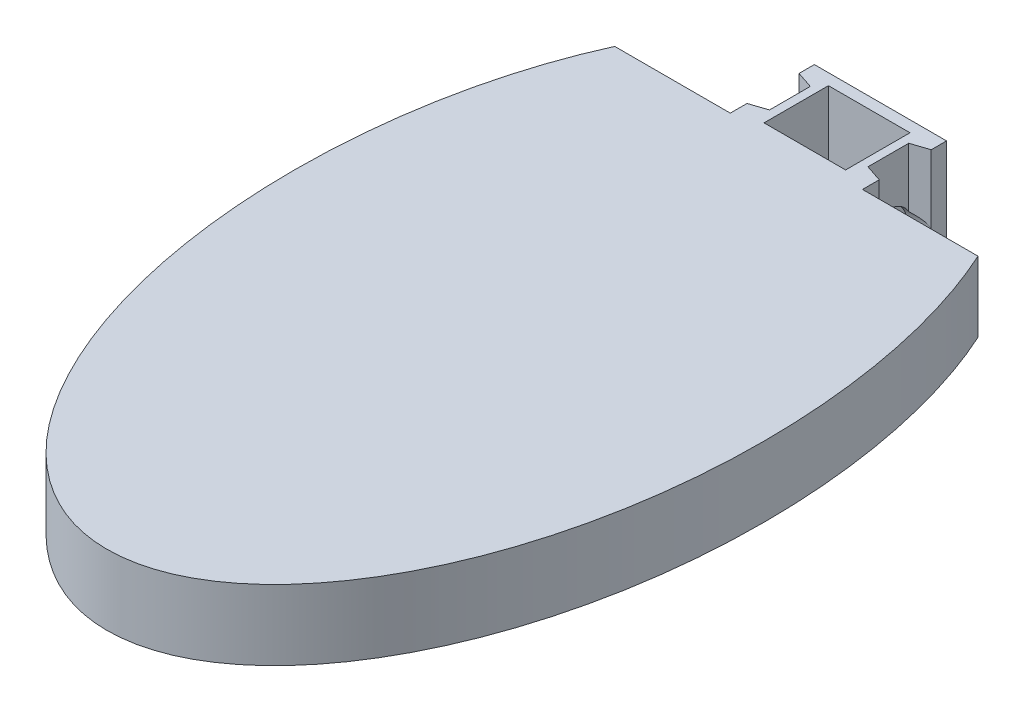
ISO-10303-21;
HEADER;
FILE_DESCRIPTION(('STEP AP214'),'2;1');
FILE_NAME('part.step','',(''),(''),'','','');
FILE_SCHEMA(('AUTOMOTIVE_DESIGN { 1 0 10303 214 1 1 1 1 }'));
ENDSEC;
DATA;
#1=APPLICATION_CONTEXT('core data for automotive mechanical design processes');
#2=APPLICATION_PROTOCOL_DEFINITION('international standard','automotive_design',2000,#1);
#3=PRODUCT_CONTEXT('',#1,'mechanical');
#4=PRODUCT('Part','Part','',(#3));
#5=PRODUCT_RELATED_PRODUCT_CATEGORY('part','',(#4));
#6=PRODUCT_DEFINITION_FORMATION('','',#4);
#7=PRODUCT_DEFINITION_CONTEXT('part definition',#1,'design');
#8=PRODUCT_DEFINITION('design','',#6,#7);
#9=PRODUCT_DEFINITION_SHAPE('','',#8);
#10=(LENGTH_UNIT() NAMED_UNIT(*) SI_UNIT(.MILLI.,.METRE.));
#11=(NAMED_UNIT(*) PLANE_ANGLE_UNIT() SI_UNIT($,.RADIAN.));
#12=(NAMED_UNIT(*) SI_UNIT($,.STERADIAN.) SOLID_ANGLE_UNIT());
#13=UNCERTAINTY_MEASURE_WITH_UNIT(LENGTH_MEASURE(1.E-05),#10,'distance_accuracy_value','');
#14=(GEOMETRIC_REPRESENTATION_CONTEXT(3) GLOBAL_UNCERTAINTY_ASSIGNED_CONTEXT((#13)) GLOBAL_UNIT_ASSIGNED_CONTEXT((#10,
#11,#12)) REPRESENTATION_CONTEXT('',''));
#15=CARTESIAN_POINT('',(0.,0.,0.));
#16=DIRECTION('',(0.,0.,1.));
#17=DIRECTION('',(1.,0.,0.));
#18=AXIS2_PLACEMENT_3D('',#15,#16,#17);
#19=CARTESIAN_POINT('',(-5.969,3.81,-24.1554));
#20=DIRECTION('',(-1.,0.,0.));
#21=DIRECTION('',(0.,0.,1.));
#22=AXIS2_PLACEMENT_3D('',#19,#20,#21);
#23=PLANE('',#22);
#24=DIRECTION('',(0.,1.,0.));
#25=VECTOR('',#24,1.);
#26=CARTESIAN_POINT('',(-5.969,0.,-30.3657));
#27=LINE('',#26,#25);
#28=CARTESIAN_POINT('',(-5.969,0.,-30.3657));
#29=VERTEX_POINT('',#28);
#30=CARTESIAN_POINT('',(-5.969,6.35,-30.3657));
#31=VERTEX_POINT('',#30);
#32=EDGE_CURVE('E224',#29,#31,#27,.T.);
#33=ORIENTED_EDGE('',*,*,#32,.T.);
#34=DIRECTION('',(0.,0.,1.));
#35=VECTOR('',#34,1.);
#36=CARTESIAN_POINT('',(-5.969,6.35,-31.75));
#37=LINE('',#36,#35);
#38=CARTESIAN_POINT('',(-5.969,6.35,-31.75));
#39=VERTEX_POINT('',#38);
#40=EDGE_CURVE('E256',#39,#31,#37,.T.);
#41=ORIENTED_EDGE('',*,*,#40,.F.);
#42=DIRECTION('',(0.,-1.,0.));
#43=VECTOR('',#42,1.);
#44=CARTESIAN_POINT('',(-5.969,3.81,-31.75));
#45=LINE('',#44,#43);
#46=CARTESIAN_POINT('',(-5.969,-4.064,-31.75));
#47=VERTEX_POINT('',#46);
#48=EDGE_CURVE('E315',#39,#47,#45,.T.);
#49=ORIENTED_EDGE('',*,*,#48,.T.);
#50=DIRECTION('',(0.,0.,-1.));
#51=VECTOR('',#50,1.);
#52=CARTESIAN_POINT('',(-5.969,-4.064,-27.305));
#53=LINE('',#52,#51);
#54=CARTESIAN_POINT('',(-5.969,-4.064,-27.305));
#55=VERTEX_POINT('',#54);
#56=EDGE_CURVE('E284',#55,#47,#53,.T.);
#57=ORIENTED_EDGE('',*,*,#56,.F.);
#58=DIRECTION('',(0.,-0.554700196225229,-0.832050294337844));
#59=VECTOR('',#58,1.);
#60=CARTESIAN_POINT('',(-5.969,-2.032,-24.257));
#61=LINE('',#60,#59);
#62=CARTESIAN_POINT('',(-5.969,-2.032,-24.257));
#63=VERTEX_POINT('',#62);
#64=EDGE_CURVE('E289',#63,#55,#61,.T.);
#65=ORIENTED_EDGE('',*,*,#64,.F.);
#66=DIRECTION('',(0.,0.,-1.));
#67=VECTOR('',#66,1.);
#68=CARTESIAN_POINT('',(-5.969,-2.032,-24.1554));
#69=LINE('',#68,#67);
#70=CARTESIAN_POINT('',(-5.969,-2.032,-24.1554));
#71=VERTEX_POINT('',#70);
#72=EDGE_CURVE('E293',#71,#63,#69,.T.);
#73=ORIENTED_EDGE('',*,*,#72,.F.);
#74=DIRECTION('',(0.,-1.,0.));
#75=VECTOR('',#74,1.);
#76=CARTESIAN_POINT('',(-5.969,3.81,-24.1554));
#77=LINE('',#76,#75);
#78=CARTESIAN_POINT('',(-5.969,0.,-24.1554));
#79=VERTEX_POINT('',#78);
#80=EDGE_CURVE('E274',#79,#71,#77,.T.);
#81=ORIENTED_EDGE('',*,*,#80,.F.);
#82=DIRECTION('',(0.,-1.,0.));
#83=VECTOR('',#82,1.);
#84=CARTESIAN_POINT('',(-5.969,3.81,-24.1554));
#85=LINE('',#84,#83);
#86=CARTESIAN_POINT('',(-5.969,6.35,-24.1554));
#87=VERTEX_POINT('',#86);
#88=EDGE_CURVE('E317',#87,#79,#85,.T.);
#89=ORIENTED_EDGE('',*,*,#88,.F.);
#90=CARTESIAN_POINT('',(-5.969,6.35,-25.6667));
#91=VERTEX_POINT('',#90);
#92=EDGE_CURVE('E250',#91,#87,#37,.T.);
#93=ORIENTED_EDGE('',*,*,#92,.F.);
#94=DIRECTION('',(0.,1.,0.));
#95=VECTOR('',#94,1.);
#96=CARTESIAN_POINT('',(-5.969,0.,-25.6667));
#97=LINE('',#96,#95);
#98=CARTESIAN_POINT('',(-5.969,0.,-25.6667));
#99=VERTEX_POINT('',#98);
#100=EDGE_CURVE('E223',#99,#91,#97,.T.);
#101=ORIENTED_EDGE('',*,*,#100,.F.);
#102=CARTESIAN_POINT('',(-5.969,0.,-28.0162));
#103=DIRECTION('',(-1.,0.,0.));
#104=DIRECTION('',(0.,0.,1.));
#105=AXIS2_PLACEMENT_3D('',#102,#103,#104);
#106=CIRCLE('',#105,2.3495);
#107=EDGE_CURVE('E227',#29,#99,#106,.T.);
#108=ORIENTED_EDGE('',*,*,#107,.F.);
#109=EDGE_LOOP('',(#33,#41,#49,#57,#65,#73,#81,#89,#93,#101,#108));
#110=FACE_BOUND('',#109,.T.);
#111=ADVANCED_FACE('F35',(#110),#23,.T.);
#112=CARTESIAN_POINT('',(5.969,3.81,-31.75));
#113=DIRECTION('',(1.,0.,0.));
#114=DIRECTION('',(0.,0.,-1.));
#115=AXIS2_PLACEMENT_3D('',#112,#113,#114);
#116=PLANE('',#115);
#117=CARTESIAN_POINT('',(5.969,0.,-28.0162));
#118=DIRECTION('',(-1.,0.,0.));
#119=DIRECTION('',(0.,0.,1.));
#120=AXIS2_PLACEMENT_3D('',#117,#118,#119);
#121=CIRCLE('',#120,2.3495);
#122=CARTESIAN_POINT('',(5.969,0.,-30.3657));
#123=VERTEX_POINT('',#122);
#124=CARTESIAN_POINT('',(5.969,0.,-25.6667));
#125=VERTEX_POINT('',#124);
#126=EDGE_CURVE('E263',#123,#125,#121,.T.);
#127=ORIENTED_EDGE('',*,*,#126,.T.);
#128=DIRECTION('',(0.,1.,0.));
#129=VECTOR('',#128,1.);
#130=CARTESIAN_POINT('',(5.969,0.,-25.6667));
#131=LINE('',#130,#129);
#132=CARTESIAN_POINT('',(5.969,6.35,-25.6667));
#133=VERTEX_POINT('',#132);
#134=EDGE_CURVE('E247',#125,#133,#131,.T.);
#135=ORIENTED_EDGE('',*,*,#134,.T.);
#136=DIRECTION('',(0.,0.,-1.));
#137=VECTOR('',#136,1.);
#138=CARTESIAN_POINT('',(5.969,6.35,-24.1554));
#139=LINE('',#138,#137);
#140=CARTESIAN_POINT('',(5.969,6.35,-24.1554));
#141=VERTEX_POINT('',#140);
#142=EDGE_CURVE('E260',#141,#133,#139,.T.);
#143=ORIENTED_EDGE('',*,*,#142,.F.);
#144=DIRECTION('',(0.,-1.,0.));
#145=VECTOR('',#144,1.);
#146=CARTESIAN_POINT('',(5.969,3.81,-24.1554));
#147=LINE('',#146,#145);
#148=CARTESIAN_POINT('',(5.969,0.,-24.1554));
#149=VERTEX_POINT('',#148);
#150=EDGE_CURVE('E310',#141,#149,#147,.T.);
#151=ORIENTED_EDGE('',*,*,#150,.T.);
#152=DIRECTION('',(0.,-1.,0.));
#153=VECTOR('',#152,1.);
#154=CARTESIAN_POINT('',(5.969,3.81,-24.1554));
#155=LINE('',#154,#153);
#156=CARTESIAN_POINT('',(5.969,-2.032,-24.1554));
#157=VERTEX_POINT('',#156);
#158=EDGE_CURVE('E270',#149,#157,#155,.T.);
#159=ORIENTED_EDGE('',*,*,#158,.T.);
#160=DIRECTION('',(0.,0.,-1.));
#161=VECTOR('',#160,1.);
#162=CARTESIAN_POINT('',(5.969,-2.032,-24.1554));
#163=LINE('',#162,#161);
#164=CARTESIAN_POINT('',(5.969,-2.032,-24.257));
#165=VERTEX_POINT('',#164);
#166=EDGE_CURVE('E278',#157,#165,#163,.T.);
#167=ORIENTED_EDGE('',*,*,#166,.T.);
#168=DIRECTION('',(0.,-0.554700196225229,-0.832050294337844));
#169=VECTOR('',#168,1.);
#170=CARTESIAN_POINT('',(5.969,-2.032,-24.257));
#171=LINE('',#170,#169);
#172=CARTESIAN_POINT('',(5.969,-4.064,-27.305));
#173=VERTEX_POINT('',#172);
#174=EDGE_CURVE('E275',#165,#173,#171,.T.);
#175=ORIENTED_EDGE('',*,*,#174,.T.);
#176=DIRECTION('',(0.,0.,-1.));
#177=VECTOR('',#176,1.);
#178=CARTESIAN_POINT('',(5.969,-4.064,-27.305));
#179=LINE('',#178,#177);
#180=CARTESIAN_POINT('',(5.969,-4.064,-31.75));
#181=VERTEX_POINT('',#180);
#182=EDGE_CURVE('E271',#173,#181,#179,.T.);
#183=ORIENTED_EDGE('',*,*,#182,.T.);
#184=DIRECTION('',(0.,-1.,0.));
#185=VECTOR('',#184,1.);
#186=CARTESIAN_POINT('',(5.969,3.81,-31.75));
#187=LINE('',#186,#185);
#188=CARTESIAN_POINT('',(5.969,6.35,-31.75));
#189=VERTEX_POINT('',#188);
#190=EDGE_CURVE('E313',#189,#181,#187,.T.);
#191=ORIENTED_EDGE('',*,*,#190,.F.);
#192=CARTESIAN_POINT('',(5.969,6.35,-30.3657));
#193=VERTEX_POINT('',#192);
#194=EDGE_CURVE('E264',#193,#189,#139,.T.);
#195=ORIENTED_EDGE('',*,*,#194,.F.);
#196=DIRECTION('',(0.,1.,0.));
#197=VECTOR('',#196,1.);
#198=CARTESIAN_POINT('',(5.969,0.,-30.3657));
#199=LINE('',#198,#197);
#200=EDGE_CURVE('E246',#123,#193,#199,.T.);
#201=ORIENTED_EDGE('',*,*,#200,.F.);
#202=EDGE_LOOP('',(#127,#135,#143,#151,#159,#167,#175,#183,#191,#195,#201));
#203=FACE_BOUND('',#202,.T.);
#204=ADVANCED_FACE('F385',(#203),#116,.T.);
#205=CARTESIAN_POINT('',(0.,6.35,0.));
#206=DIRECTION('',(0.,1.,0.));
#207=DIRECTION('',(0.,0.,1.));
#208=AXIS2_PLACEMENT_3D('',#205,#206,#207);
#209=PLANE('',#208);
#210=DIRECTION('',(1.,0.,0.));
#211=VECTOR('',#210,1.);
#212=CARTESIAN_POINT('',(-3.683,6.35,-24.9174));
#213=LINE('',#212,#211);
#214=CARTESIAN_POINT('',(-3.683,6.35,-24.9174));
#215=VERTEX_POINT('',#214);
#216=CARTESIAN_POINT('',(3.683,6.35,-24.9174));
#217=VERTEX_POINT('',#216);
#218=EDGE_CURVE('E195',#215,#217,#213,.T.);
#219=ORIENTED_EDGE('',*,*,#218,.F.);
#220=DIRECTION('',(0.,0.,1.));
#221=VECTOR('',#220,1.);
#222=CARTESIAN_POINT('',(-3.683,6.35,-30.734));
#223=LINE('',#222,#221);
#224=CARTESIAN_POINT('',(-3.683,6.35,-30.734));
#225=VERTEX_POINT('',#224);
#226=EDGE_CURVE('E206',#225,#215,#223,.T.);
#227=ORIENTED_EDGE('',*,*,#226,.F.);
#228=DIRECTION('',(-1.,0.,0.));
#229=VECTOR('',#228,1.);
#230=CARTESIAN_POINT('',(-3.683,6.35,-30.734));
#231=LINE('',#230,#229);
#232=CARTESIAN_POINT('',(3.683,6.35,-30.734));
#233=VERTEX_POINT('',#232);
#234=EDGE_CURVE('E51',#233,#225,#231,.T.);
#235=ORIENTED_EDGE('',*,*,#234,.F.);
#236=DIRECTION('',(0.,0.,-1.));
#237=VECTOR('',#236,1.);
#238=CARTESIAN_POINT('',(3.683,6.35,-30.734));
#239=LINE('',#238,#237);
#240=EDGE_CURVE('E202',#217,#233,#239,.T.);
#241=ORIENTED_EDGE('',*,*,#240,.F.);
#242=EDGE_LOOP('',(#219,#227,#235,#241));
#243=FACE_BOUND('',#242,.T.);
#244=DIRECTION('',(-0.948683298050514,0.,-0.316227766016839));
#245=VECTOR('',#244,1.);
#246=CARTESIAN_POINT('',(-4.445,6.35,-29.8577));
#247=LINE('',#246,#245);
#248=CARTESIAN_POINT('',(-4.445,6.35,-29.8577));
#249=VERTEX_POINT('',#248);
#250=EDGE_CURVE('E221',#249,#31,#247,.T.);
#251=ORIENTED_EDGE('',*,*,#250,.F.);
#252=DIRECTION('',(0.,0.,-1.));
#253=VECTOR('',#252,1.);
#254=CARTESIAN_POINT('',(-4.445,6.35,-26.1747));
#255=LINE('',#254,#253);
#256=CARTESIAN_POINT('',(-4.445,6.35,-26.1747));
#257=VERTEX_POINT('',#256);
#258=EDGE_CURVE('E218',#257,#249,#255,.T.);
#259=ORIENTED_EDGE('',*,*,#258,.F.);
#260=DIRECTION('',(0.948683298050514,0.,-0.316227766016839));
#261=VECTOR('',#260,1.);
#262=CARTESIAN_POINT('',(-5.969,6.35,-25.6667));
#263=LINE('',#262,#261);
#264=EDGE_CURVE('E216',#91,#257,#263,.T.);
#265=ORIENTED_EDGE('',*,*,#264,.F.);
#266=ORIENTED_EDGE('',*,*,#92,.T.);
#267=DIRECTION('',(-1.,0.,0.));
#268=VECTOR('',#267,1.);
#269=CARTESIAN_POINT('',(-5.969,6.35,-24.1554));
#270=LINE('',#269,#268);
#271=CARTESIAN_POINT('',(-16.4016205721253,6.35,-24.1554));
#272=VERTEX_POINT('',#271);
#273=EDGE_CURVE('E259',#87,#272,#270,.T.);
#274=ORIENTED_EDGE('',*,*,#273,.T.);
#275=CARTESIAN_POINT('',(0.,6.35,0.));
#276=DIRECTION('',(0.,1.,0.));
#277=DIRECTION('',(0.,0.,-1.));
#278=AXIS2_PLACEMENT_3D('',#275,#276,#277);
#279=ELLIPSE('',#278,38.1,21.209);
#280=CARTESIAN_POINT('',(16.4016205721253,6.35,-24.1554));
#281=VERTEX_POINT('',#280);
#282=EDGE_CURVE('E329',#272,#281,#279,.T.);
#283=ORIENTED_EDGE('',*,*,#282,.T.);
#284=DIRECTION('',(-1.,0.,0.));
#285=VECTOR('',#284,1.);
#286=CARTESIAN_POINT('',(16.4016205721253,6.35,-24.1554));
#287=LINE('',#286,#285);
#288=EDGE_CURVE('E337',#281,#141,#287,.T.);
#289=ORIENTED_EDGE('',*,*,#288,.T.);
#290=ORIENTED_EDGE('',*,*,#142,.T.);
#291=DIRECTION('',(-0.948683298050514,0.,-0.316227766016839));
#292=VECTOR('',#291,1.);
#293=CARTESIAN_POINT('',(5.969,6.35,-25.6667));
#294=LINE('',#293,#292);
#295=CARTESIAN_POINT('',(4.445,6.35,-26.1747));
#296=VERTEX_POINT('',#295);
#297=EDGE_CURVE('E243',#133,#296,#294,.T.);
#298=ORIENTED_EDGE('',*,*,#297,.T.);
#299=DIRECTION('',(0.,0.,-1.));
#300=VECTOR('',#299,1.);
#301=CARTESIAN_POINT('',(4.445,6.35,-26.1747));
#302=LINE('',#301,#300);
#303=CARTESIAN_POINT('',(4.445,6.35,-29.8577));
#304=VERTEX_POINT('',#303);
#305=EDGE_CURVE('E240',#296,#304,#302,.T.);
#306=ORIENTED_EDGE('',*,*,#305,.T.);
#307=DIRECTION('',(0.948683298050514,0.,-0.316227766016839));
#308=VECTOR('',#307,1.);
#309=CARTESIAN_POINT('',(4.445,6.35,-29.8577));
#310=LINE('',#309,#308);
#311=EDGE_CURVE('E237',#304,#193,#310,.T.);
#312=ORIENTED_EDGE('',*,*,#311,.T.);
#313=ORIENTED_EDGE('',*,*,#194,.T.);
#314=DIRECTION('',(1.,0.,0.));
#315=VECTOR('',#314,1.);
#316=CARTESIAN_POINT('',(-11.7237158631079,6.35,-31.75));
#317=LINE('',#316,#315);
#318=EDGE_CURVE('E320',#39,#189,#317,.T.);
#319=ORIENTED_EDGE('',*,*,#318,.F.);
#320=ORIENTED_EDGE('',*,*,#40,.T.);
#321=EDGE_LOOP('',(#251,#259,#265,#266,#274,#283,#289,#290,#298,#306,#312,#313,#319,#320));
#322=FACE_BOUND('',#321,.T.);
#323=ADVANCED_FACE('F372',(#243,#322),#209,.T.);
#324=CARTESIAN_POINT('',(5.969,0.,-28.0162));
#325=DIRECTION('',(1.,0.,0.));
#326=DIRECTION('',(0.,0.,-1.));
#327=AXIS2_PLACEMENT_3D('',#324,#325,#326);
#328=CONICAL_SURFACE('',#327,2.3495,0.165148677414628);
#329=CARTESIAN_POINT('',(4.064,0.,-28.0162));
#330=DIRECTION('',(-1.,0.,0.));
#331=DIRECTION('',(0.,0.,1.));
#332=AXIS2_PLACEMENT_3D('',#329,#330,#331);
#333=CIRCLE('',#332,2.032);
#334=CARTESIAN_POINT('',(4.064,0.,-25.9842));
#335=VERTEX_POINT('',#334);
#336=EDGE_CURVE('E267',#335,#335,#333,.T.);
#337=ORIENTED_EDGE('',*,*,#336,.T.);
#338=EDGE_LOOP('',(#337));
#339=FACE_BOUND('',#338,.T.);
#340=CARTESIAN_POINT('',(4.445,0.,-28.0162));
#341=DIRECTION('',(1.,0.,0.));
#342=DIRECTION('',(0.,0.,-1.));
#343=AXIS2_PLACEMENT_3D('',#340,#341,#342);
#344=CIRCLE('',#343,2.0955);
#345=CARTESIAN_POINT('',(4.445,0.999998999999502,-29.8577));
#346=VERTEX_POINT('',#345);
#347=CARTESIAN_POINT('',(4.445,0.999998999999501,-26.1747));
#348=VERTEX_POINT('',#347);
#349=EDGE_CURVE('E345',#346,#348,#344,.T.);
#350=ORIENTED_EDGE('',*,*,#349,.T.);
#351=CARTESIAN_POINT('',(1.27000000000002,0.,-27.2330333333333));
#352=DIRECTION('',(0.316227766016839,0.,-0.948683298050513));
#353=DIRECTION('',(0.948683298050513,0.,0.316227766016839));
#354=AXIS2_PLACEMENT_3D('',#351,#352,#353);
#355=ELLIPSE('',#354,4.95318090837705,1.35648445746102);
#356=EDGE_CURVE('E348',#348,#125,#355,.T.);
#357=ORIENTED_EDGE('',*,*,#356,.T.);
#358=ORIENTED_EDGE('',*,*,#126,.F.);
#359=CARTESIAN_POINT('',(1.27000000000003,0.,-28.7993666666667));
#360=DIRECTION('',(0.316227766016839,0.,0.948683298050513));
#361=DIRECTION('',(0.948683298050513,0.,-0.316227766016839));
#362=AXIS2_PLACEMENT_3D('',#359,#360,#361);
#363=ELLIPSE('',#362,4.95318090837705,1.35648445746102);
#364=EDGE_CURVE('E332',#123,#346,#363,.T.);
#365=ORIENTED_EDGE('',*,*,#364,.T.);
#366=EDGE_LOOP('',(#350,#357,#358,#365));
#367=FACE_BOUND('',#366,.T.);
#368=ADVANCED_FACE('F449',(#339,#367),#328,.F.);
#369=DIRECTION('',(0.,-1.,0.));
#370=VECTOR('',#369,1.);
#371=SURFACE_OF_LINEAR_EXTRUSION('',#279,#370);
#372=ORIENTED_EDGE('',*,*,#282,.F.);
#373=DIRECTION('',(0.,-1.,0.));
#374=VECTOR('',#373,1.);
#375=CARTESIAN_POINT('',(-16.4016205721253,6.35,-24.1554));
#376=LINE('',#375,#374);
#377=CARTESIAN_POINT('',(-16.4016205721253,0.,-24.1554));
#378=VERTEX_POINT('',#377);
#379=EDGE_CURVE('E323',#378,#272,#376,.F.);
#380=ORIENTED_EDGE('',*,*,#379,.F.);
#381=CARTESIAN_POINT('',(0.,0.,0.));
#382=DIRECTION('',(0.,1.,0.));
#383=DIRECTION('',(0.,0.,-1.));
#384=AXIS2_PLACEMENT_3D('',#381,#382,#383);
#385=ELLIPSE('',#384,38.1,21.209);
#386=CARTESIAN_POINT('',(16.4016205721253,0.,-24.1554));
#387=VERTEX_POINT('',#386);
#388=EDGE_CURVE('E322',#378,#387,#385,.T.);
#389=ORIENTED_EDGE('',*,*,#388,.T.);
#390=DIRECTION('',(0.,-1.,0.));
#391=VECTOR('',#390,1.);
#392=CARTESIAN_POINT('',(16.4016205721253,6.35,-24.1554));
#393=LINE('',#392,#391);
#394=EDGE_CURVE('E319',#281,#387,#393,.T.);
#395=ORIENTED_EDGE('',*,*,#394,.F.);
#396=EDGE_LOOP('',(#372,#380,#389,#395));
#397=FACE_BOUND('',#396,.T.);
#398=ADVANCED_FACE('F37',(#397),#371,.F.);
#399=CARTESIAN_POINT('',(0.,0.,0.));
#400=DIRECTION('',(0.,1.,0.));
#401=DIRECTION('',(0.,0.,1.));
#402=AXIS2_PLACEMENT_3D('',#399,#400,#401);
#403=PLANE('',#402);
#404=DIRECTION('',(1.,0.,0.));
#405=VECTOR('',#404,1.);
#406=CARTESIAN_POINT('',(-25.8682538538721,0.,-24.1554));
#407=LINE('',#406,#405);
#408=EDGE_CURVE('E304',#378,#79,#407,.T.);
#409=ORIENTED_EDGE('',*,*,#408,.T.);
#410=DIRECTION('',(1.,0.,0.));
#411=VECTOR('',#410,1.);
#412=CARTESIAN_POINT('',(0.,0.,-24.1554));
#413=LINE('',#412,#411);
#414=EDGE_CURVE('E298',#79,#149,#413,.T.);
#415=ORIENTED_EDGE('',*,*,#414,.T.);
#416=DIRECTION('',(1.,0.,0.));
#417=VECTOR('',#416,1.);
#418=CARTESIAN_POINT('',(5.969,0.,-24.1554));
#419=LINE('',#418,#417);
#420=EDGE_CURVE('E307',#149,#387,#419,.T.);
#421=ORIENTED_EDGE('',*,*,#420,.T.);
#422=ORIENTED_EDGE('',*,*,#388,.F.);
#423=EDGE_LOOP('',(#409,#415,#421,#422));
#424=FACE_BOUND('',#423,.T.);
#425=ADVANCED_FACE('F405',(#424),#403,.F.);
#426=CARTESIAN_POINT('',(-11.7237158631079,0.,-31.75));
#427=DIRECTION('',(0.,0.,1.));
#428=DIRECTION('',(1.,0.,0.));
#429=AXIS2_PLACEMENT_3D('',#426,#427,#428);
#430=PLANE('',#429);
#431=ORIENTED_EDGE('',*,*,#48,.F.);
#432=ORIENTED_EDGE('',*,*,#318,.T.);
#433=ORIENTED_EDGE('',*,*,#190,.T.);
#434=DIRECTION('',(1.,0.,0.));
#435=VECTOR('',#434,1.);
#436=CARTESIAN_POINT('',(-16.9087360644578,-4.064,-31.75));
#437=LINE('',#436,#435);
#438=EDGE_CURVE('E287',#47,#181,#437,.T.);
#439=ORIENTED_EDGE('',*,*,#438,.F.);
#440=EDGE_LOOP('',(#431,#432,#433,#439));
#441=FACE_BOUND('',#440,.T.);
#442=ADVANCED_FACE('F383',(#441),#430,.F.);
#443=CARTESIAN_POINT('',(-25.8682538538721,3.81,-24.1554));
#444=DIRECTION('',(0.,0.,-1.));
#445=DIRECTION('',(-1.,0.,0.));
#446=AXIS2_PLACEMENT_3D('',#443,#444,#445);
#447=PLANE('',#446);
#448=ORIENTED_EDGE('',*,*,#379,.T.);
#449=ORIENTED_EDGE('',*,*,#273,.F.);
#450=ORIENTED_EDGE('',*,*,#88,.T.);
#451=ORIENTED_EDGE('',*,*,#408,.F.);
#452=EDGE_LOOP('',(#448,#449,#450,#451));
#453=FACE_BOUND('',#452,.T.);
#454=ADVANCED_FACE('F420',(#453),#447,.T.);
#455=CARTESIAN_POINT('',(5.969,3.81,-24.1554));
#456=DIRECTION('',(0.,0.,-1.));
#457=DIRECTION('',(-1.,0.,0.));
#458=AXIS2_PLACEMENT_3D('',#455,#456,#457);
#459=PLANE('',#458);
#460=ORIENTED_EDGE('',*,*,#394,.T.);
#461=ORIENTED_EDGE('',*,*,#420,.F.);
#462=ORIENTED_EDGE('',*,*,#150,.F.);
#463=ORIENTED_EDGE('',*,*,#288,.F.);
#464=EDGE_LOOP('',(#460,#461,#462,#463));
#465=FACE_BOUND('',#464,.T.);
#466=ADVANCED_FACE('F413',(#465),#459,.T.);
#467=CARTESIAN_POINT('',(-16.9087360644578,3.81,-24.1554));
#468=DIRECTION('',(0.,0.,1.));
#469=DIRECTION('',(1.,0.,0.));
#470=AXIS2_PLACEMENT_3D('',#467,#468,#469);
#471=PLANE('',#470);
#472=ORIENTED_EDGE('',*,*,#414,.F.);
#473=ORIENTED_EDGE('',*,*,#80,.T.);
#474=DIRECTION('',(1.,0.,0.));
#475=VECTOR('',#474,1.);
#476=CARTESIAN_POINT('',(-16.9087360644578,-2.032,-24.1554));
#477=LINE('',#476,#475);
#478=EDGE_CURVE('E283',#71,#157,#477,.T.);
#479=ORIENTED_EDGE('',*,*,#478,.T.);
#480=ORIENTED_EDGE('',*,*,#158,.F.);
#481=EDGE_LOOP('',(#472,#473,#479,#480));
#482=FACE_BOUND('',#481,.T.);
#483=ADVANCED_FACE('F403',(#482),#471,.T.);
#484=CARTESIAN_POINT('',(-16.9087360644578,-2.032,-24.1554));
#485=DIRECTION('',(0.,-1.,0.));
#486=DIRECTION('',(0.,0.,-1.));
#487=AXIS2_PLACEMENT_3D('',#484,#485,#486);
#488=PLANE('',#487);
#489=ORIENTED_EDGE('',*,*,#478,.F.);
#490=ORIENTED_EDGE('',*,*,#72,.T.);
#491=DIRECTION('',(1.,0.,0.));
#492=VECTOR('',#491,1.);
#493=CARTESIAN_POINT('',(-16.9087360644578,-2.032,-24.257));
#494=LINE('',#493,#492);
#495=EDGE_CURVE('E292',#63,#165,#494,.T.);
#496=ORIENTED_EDGE('',*,*,#495,.T.);
#497=ORIENTED_EDGE('',*,*,#166,.F.);
#498=EDGE_LOOP('',(#489,#490,#496,#497));
#499=FACE_BOUND('',#498,.T.);
#500=ADVANCED_FACE('F399',(#499),#488,.T.);
#501=CARTESIAN_POINT('',(-16.9087360644578,-2.032,-24.257));
#502=DIRECTION('',(0.,-0.832050294337844,0.554700196225229));
#503=DIRECTION('',(0.,-0.554700196225229,-0.832050294337844));
#504=AXIS2_PLACEMENT_3D('',#501,#502,#503);
#505=PLANE('',#504);
#506=ORIENTED_EDGE('',*,*,#495,.F.);
#507=ORIENTED_EDGE('',*,*,#64,.T.);
#508=DIRECTION('',(1.,0.,0.));
#509=VECTOR('',#508,1.);
#510=CARTESIAN_POINT('',(-16.9087360644578,-4.064,-27.305));
#511=LINE('',#510,#509);
#512=EDGE_CURVE('E288',#55,#173,#511,.T.);
#513=ORIENTED_EDGE('',*,*,#512,.T.);
#514=ORIENTED_EDGE('',*,*,#174,.F.);
#515=EDGE_LOOP('',(#506,#507,#513,#514));
#516=FACE_BOUND('',#515,.T.);
#517=ADVANCED_FACE('F396',(#516),#505,.T.);
#518=CARTESIAN_POINT('',(-16.9087360644578,-4.064,-27.305));
#519=DIRECTION('',(0.,-1.,0.));
#520=DIRECTION('',(0.,0.,-1.));
#521=AXIS2_PLACEMENT_3D('',#518,#519,#520);
#522=PLANE('',#521);
#523=ORIENTED_EDGE('',*,*,#512,.F.);
#524=ORIENTED_EDGE('',*,*,#56,.T.);
#525=ORIENTED_EDGE('',*,*,#438,.T.);
#526=ORIENTED_EDGE('',*,*,#182,.F.);
#527=EDGE_LOOP('',(#523,#524,#525,#526));
#528=FACE_BOUND('',#527,.T.);
#529=ADVANCED_FACE('F391',(#528),#522,.T.);
#530=CARTESIAN_POINT('',(4.064,0.,-28.0162));
#531=DIRECTION('',(1.,0.,0.));
#532=DIRECTION('',(0.,0.,-1.));
#533=AXIS2_PLACEMENT_3D('',#530,#531,#532);
#534=PLANE('',#533);
#535=ORIENTED_EDGE('',*,*,#336,.F.);
#536=EDGE_LOOP('',(#535));
#537=FACE_BOUND('',#536,.T.);
#538=ADVANCED_FACE('F444',(#537),#534,.T.);
#539=CARTESIAN_POINT('',(5.969,0.,-25.6667));
#540=DIRECTION('',(0.316227766016839,0.,-0.948683298050513));
#541=DIRECTION('',(-0.948683298050514,0.,-0.316227766016839));
#542=AXIS2_PLACEMENT_3D('',#539,#540,#541);
#543=PLANE('',#542);
#544=DIRECTION('',(0.,1.,0.));
#545=VECTOR('',#544,1.);
#546=CARTESIAN_POINT('',(4.445,0.,-26.1747));
#547=LINE('',#546,#545);
#548=EDGE_CURVE('E251',#348,#296,#547,.T.);
#549=ORIENTED_EDGE('',*,*,#548,.T.);
#550=ORIENTED_EDGE('',*,*,#297,.F.);
#551=ORIENTED_EDGE('',*,*,#134,.F.);
#552=ORIENTED_EDGE('',*,*,#356,.F.);
#553=EDGE_LOOP('',(#549,#550,#551,#552));
#554=FACE_BOUND('',#553,.T.);
#555=ADVANCED_FACE('F447',(#554),#543,.T.);
#556=CARTESIAN_POINT('',(4.445,0.,-26.1747));
#557=DIRECTION('',(1.,0.,0.));
#558=DIRECTION('',(0.,0.,-1.));
#559=AXIS2_PLACEMENT_3D('',#556,#557,#558);
#560=PLANE('',#559);
#561=DIRECTION('',(0.,1.,0.));
#562=VECTOR('',#561,1.);
#563=CARTESIAN_POINT('',(4.445,0.,-29.8577));
#564=LINE('',#563,#562);
#565=EDGE_CURVE('E253',#346,#304,#564,.T.);
#566=ORIENTED_EDGE('',*,*,#565,.T.);
#567=ORIENTED_EDGE('',*,*,#305,.F.);
#568=ORIENTED_EDGE('',*,*,#548,.F.);
#569=ORIENTED_EDGE('',*,*,#349,.F.);
#570=EDGE_LOOP('',(#566,#567,#568,#569));
#571=FACE_BOUND('',#570,.T.);
#572=ADVANCED_FACE('F457',(#571),#560,.T.);
#573=CARTESIAN_POINT('',(4.445,0.,-29.8577));
#574=DIRECTION('',(0.316227766016839,0.,0.948683298050513));
#575=DIRECTION('',(0.948683298050514,0.,-0.316227766016839));
#576=AXIS2_PLACEMENT_3D('',#573,#574,#575);
#577=PLANE('',#576);
#578=ORIENTED_EDGE('',*,*,#200,.T.);
#579=ORIENTED_EDGE('',*,*,#311,.F.);
#580=ORIENTED_EDGE('',*,*,#565,.F.);
#581=ORIENTED_EDGE('',*,*,#364,.F.);
#582=EDGE_LOOP('',(#578,#579,#580,#581));
#583=FACE_BOUND('',#582,.T.);
#584=ADVANCED_FACE('F453',(#583),#577,.T.);
#585=CARTESIAN_POINT('',(-4.064,0.,-28.0162));
#586=DIRECTION('',(-1.,0.,0.));
#587=DIRECTION('',(0.,0.,-1.));
#588=AXIS2_PLACEMENT_3D('',#585,#586,#587);
#589=PLANE('',#588);
#590=CARTESIAN_POINT('',(-4.064,0.,-28.0162));
#591=DIRECTION('',(-1.,0.,0.));
#592=DIRECTION('',(0.,0.,1.));
#593=AXIS2_PLACEMENT_3D('',#590,#591,#592);
#594=CIRCLE('',#593,2.032);
#595=CARTESIAN_POINT('',(-4.064,0.,-25.9842));
#596=VERTEX_POINT('',#595);
#597=EDGE_CURVE('E234',#596,#596,#594,.T.);
#598=ORIENTED_EDGE('',*,*,#597,.T.);
#599=EDGE_LOOP('',(#598));
#600=FACE_BOUND('',#599,.T.);
#601=ADVANCED_FACE('F456',(#600),#589,.T.);
#602=CARTESIAN_POINT('',(-5.969,0.,-28.0162));
#603=DIRECTION('',(-1.,0.,0.));
#604=DIRECTION('',(0.,0.,-1.));
#605=AXIS2_PLACEMENT_3D('',#602,#603,#604);
#606=CONICAL_SURFACE('',#605,2.3495,0.165148677414628);
#607=CARTESIAN_POINT('',(-1.27000000000003,0.,-28.7993666666667));
#608=DIRECTION('',(0.316227766016839,0.,-0.948683298050513));
#609=DIRECTION('',(-0.948683298050513,0.,-0.316227766016839));
#610=AXIS2_PLACEMENT_3D('',#607,#608,#609);
#611=ELLIPSE('',#610,4.95318090837705,1.35648445746102);
#612=CARTESIAN_POINT('',(-4.445,0.999998999999501,-29.8577));
#613=VERTEX_POINT('',#612);
#614=EDGE_CURVE('E11',#29,#613,#611,.T.);
#615=ORIENTED_EDGE('',*,*,#614,.F.);
#616=ORIENTED_EDGE('',*,*,#107,.T.);
#617=CARTESIAN_POINT('',(-1.27000000000002,0.,-27.2330333333333));
#618=DIRECTION('',(0.316227766016839,0.,0.948683298050513));
#619=DIRECTION('',(-0.948683298050513,0.,0.316227766016839));
#620=AXIS2_PLACEMENT_3D('',#617,#618,#619);
#621=ELLIPSE('',#620,4.95318090837705,1.35648445746102);
#622=CARTESIAN_POINT('',(-4.445,0.999998999999501,-26.1747));
#623=VERTEX_POINT('',#622);
#624=EDGE_CURVE('E351',#623,#99,#621,.T.);
#625=ORIENTED_EDGE('',*,*,#624,.F.);
#626=CARTESIAN_POINT('',(-4.445,0.,-28.0162));
#627=DIRECTION('',(1.,0.,0.));
#628=DIRECTION('',(0.,0.,-1.));
#629=AXIS2_PLACEMENT_3D('',#626,#627,#628);
#630=CIRCLE('',#629,2.0955);
#631=EDGE_CURVE('E44',#613,#623,#630,.T.);
#632=ORIENTED_EDGE('',*,*,#631,.F.);
#633=EDGE_LOOP('',(#615,#616,#625,#632));
#634=FACE_BOUND('',#633,.T.);
#635=ORIENTED_EDGE('',*,*,#597,.F.);
#636=EDGE_LOOP('',(#635));
#637=FACE_BOUND('',#636,.T.);
#638=ADVANCED_FACE('F359',(#634,#637),#606,.F.);
#639=CARTESIAN_POINT('',(-4.445,0.,-29.8577));
#640=DIRECTION('',(0.316227766016839,0.,-0.948683298050513));
#641=DIRECTION('',(-0.948683298050514,0.,-0.316227766016839));
#642=AXIS2_PLACEMENT_3D('',#639,#640,#641);
#643=PLANE('',#642);
#644=ORIENTED_EDGE('',*,*,#614,.T.);
#645=DIRECTION('',(0.,1.,0.));
#646=VECTOR('',#645,1.);
#647=CARTESIAN_POINT('',(-4.445,0.,-29.8577));
#648=LINE('',#647,#646);
#649=EDGE_CURVE('E228',#613,#249,#648,.T.);
#650=ORIENTED_EDGE('',*,*,#649,.T.);
#651=ORIENTED_EDGE('',*,*,#250,.T.);
#652=ORIENTED_EDGE('',*,*,#32,.F.);
#653=EDGE_LOOP('',(#644,#650,#651,#652));
#654=FACE_BOUND('',#653,.T.);
#655=ADVANCED_FACE('F378',(#654),#643,.F.);
#656=CARTESIAN_POINT('',(-4.445,0.,-26.1747));
#657=DIRECTION('',(1.,0.,0.));
#658=DIRECTION('',(0.,0.,-1.));
#659=AXIS2_PLACEMENT_3D('',#656,#657,#658);
#660=PLANE('',#659);
#661=ORIENTED_EDGE('',*,*,#631,.T.);
#662=DIRECTION('',(0.,1.,0.));
#663=VECTOR('',#662,1.);
#664=CARTESIAN_POINT('',(-4.445,0.,-26.1747));
#665=LINE('',#664,#663);
#666=EDGE_CURVE('E59',#623,#257,#665,.T.);
#667=ORIENTED_EDGE('',*,*,#666,.T.);
#668=ORIENTED_EDGE('',*,*,#258,.T.);
#669=ORIENTED_EDGE('',*,*,#649,.F.);
#670=EDGE_LOOP('',(#661,#667,#668,#669));
#671=FACE_BOUND('',#670,.T.);
#672=ADVANCED_FACE('F356',(#671),#660,.F.);
#673=CARTESIAN_POINT('',(-5.969,0.,-25.6667));
#674=DIRECTION('',(0.316227766016839,0.,0.948683298050513));
#675=DIRECTION('',(0.948683298050514,0.,-0.316227766016839));
#676=AXIS2_PLACEMENT_3D('',#673,#674,#675);
#677=PLANE('',#676);
#678=ORIENTED_EDGE('',*,*,#624,.T.);
#679=ORIENTED_EDGE('',*,*,#100,.T.);
#680=ORIENTED_EDGE('',*,*,#264,.T.);
#681=ORIENTED_EDGE('',*,*,#666,.F.);
#682=EDGE_LOOP('',(#678,#679,#680,#681));
#683=FACE_BOUND('',#682,.T.);
#684=ADVANCED_FACE('F363',(#683),#677,.F.);
#685=CARTESIAN_POINT('',(0.,0.,0.));
#686=DIRECTION('',(0.,-1.,0.));
#687=DIRECTION('',(0.,0.,-1.));
#688=AXIS2_PLACEMENT_3D('',#685,#686,#687);
#689=PLANE('',#688);
#690=DIRECTION('',(0.,0.,1.));
#691=VECTOR('',#690,1.);
#692=CARTESIAN_POINT('',(-3.683,0.,-30.734));
#693=LINE('',#692,#691);
#694=CARTESIAN_POINT('',(-3.683,0.,-30.734));
#695=VERTEX_POINT('',#694);
#696=CARTESIAN_POINT('',(-3.683,0.,-24.9174));
#697=VERTEX_POINT('',#696);
#698=EDGE_CURVE('E199',#695,#697,#693,.T.);
#699=ORIENTED_EDGE('',*,*,#698,.T.);
#700=DIRECTION('',(1.,0.,0.));
#701=VECTOR('',#700,1.);
#702=CARTESIAN_POINT('',(-3.683,0.,-24.9174));
#703=LINE('',#702,#701);
#704=CARTESIAN_POINT('',(3.683,0.,-24.9174));
#705=VERTEX_POINT('',#704);
#706=EDGE_CURVE('E192',#697,#705,#703,.T.);
#707=ORIENTED_EDGE('',*,*,#706,.T.);
#708=DIRECTION('',(0.,0.,-1.));
#709=VECTOR('',#708,1.);
#710=CARTESIAN_POINT('',(3.683,0.,-30.734));
#711=LINE('',#710,#709);
#712=CARTESIAN_POINT('',(3.683,0.,-30.734));
#713=VERTEX_POINT('',#712);
#714=EDGE_CURVE('E179',#705,#713,#711,.T.);
#715=ORIENTED_EDGE('',*,*,#714,.T.);
#716=DIRECTION('',(-1.,0.,0.));
#717=VECTOR('',#716,1.);
#718=CARTESIAN_POINT('',(-3.683,0.,-30.734));
#719=LINE('',#718,#717);
#720=EDGE_CURVE('E211',#713,#695,#719,.T.);
#721=ORIENTED_EDGE('',*,*,#720,.T.);
#722=EDGE_LOOP('',(#699,#707,#715,#721));
#723=FACE_BOUND('',#722,.T.);
#724=ADVANCED_FACE('F198',(#723),#689,.F.);
#725=CARTESIAN_POINT('',(-3.683,-9.38566947851884,-24.9174));
#726=DIRECTION('',(0.,0.,1.));
#727=DIRECTION('',(1.,0.,0.));
#728=AXIS2_PLACEMENT_3D('',#725,#726,#727);
#729=PLANE('',#728);
#730=DIRECTION('',(0.,1.,0.));
#731=VECTOR('',#730,1.);
#732=CARTESIAN_POINT('',(-3.683,-9.38566947851884,-24.9174));
#733=LINE('',#732,#731);
#734=EDGE_CURVE('E209',#697,#215,#733,.T.);
#735=ORIENTED_EDGE('',*,*,#734,.T.);
#736=ORIENTED_EDGE('',*,*,#218,.T.);
#737=DIRECTION('',(0.,1.,0.));
#738=VECTOR('',#737,1.);
#739=CARTESIAN_POINT('',(3.683,-9.38566947851884,-24.9174));
#740=LINE('',#739,#738);
#741=EDGE_CURVE('E183',#705,#217,#740,.T.);
#742=ORIENTED_EDGE('',*,*,#741,.F.);
#743=ORIENTED_EDGE('',*,*,#706,.F.);
#744=EDGE_LOOP('',(#735,#736,#742,#743));
#745=FACE_BOUND('',#744,.T.);
#746=ADVANCED_FACE('F191',(#745),#729,.F.);
#747=CARTESIAN_POINT('',(3.683,-9.38566947851884,-30.734));
#748=DIRECTION('',(1.,0.,0.));
#749=DIRECTION('',(0.,0.,-1.));
#750=AXIS2_PLACEMENT_3D('',#747,#748,#749);
#751=PLANE('',#750);
#752=ORIENTED_EDGE('',*,*,#741,.T.);
#753=ORIENTED_EDGE('',*,*,#240,.T.);
#754=DIRECTION('',(0.,1.,0.));
#755=VECTOR('',#754,1.);
#756=CARTESIAN_POINT('',(3.683,-9.38566947851884,-30.734));
#757=LINE('',#756,#755);
#758=EDGE_CURVE('E185',#713,#233,#757,.T.);
#759=ORIENTED_EDGE('',*,*,#758,.F.);
#760=ORIENTED_EDGE('',*,*,#714,.F.);
#761=EDGE_LOOP('',(#752,#753,#759,#760));
#762=FACE_BOUND('',#761,.T.);
#763=ADVANCED_FACE('F181',(#762),#751,.F.);
#764=CARTESIAN_POINT('',(-3.683,-9.38566947851884,-30.734));
#765=DIRECTION('',(0.,0.,-1.));
#766=DIRECTION('',(-1.,0.,0.));
#767=AXIS2_PLACEMENT_3D('',#764,#765,#766);
#768=PLANE('',#767);
#769=ORIENTED_EDGE('',*,*,#758,.T.);
#770=ORIENTED_EDGE('',*,*,#234,.T.);
#771=DIRECTION('',(0.,1.,0.));
#772=VECTOR('',#771,1.);
#773=CARTESIAN_POINT('',(-3.683,-9.38566947851884,-30.734));
#774=LINE('',#773,#772);
#775=EDGE_CURVE('E210',#695,#225,#774,.T.);
#776=ORIENTED_EDGE('',*,*,#775,.F.);
#777=ORIENTED_EDGE('',*,*,#720,.F.);
#778=EDGE_LOOP('',(#769,#770,#776,#777));
#779=FACE_BOUND('',#778,.T.);
#780=ADVANCED_FACE('F482',(#779),#768,.F.);
#781=CARTESIAN_POINT('',(-3.683,-9.38566947851884,-30.734));
#782=DIRECTION('',(-1.,0.,0.));
#783=DIRECTION('',(0.,0.,1.));
#784=AXIS2_PLACEMENT_3D('',#781,#782,#783);
#785=PLANE('',#784);
#786=ORIENTED_EDGE('',*,*,#775,.T.);
#787=ORIENTED_EDGE('',*,*,#226,.T.);
#788=ORIENTED_EDGE('',*,*,#734,.F.);
#789=ORIENTED_EDGE('',*,*,#698,.F.);
#790=EDGE_LOOP('',(#786,#787,#788,#789));
#791=FACE_BOUND('',#790,.T.);
#792=ADVANCED_FACE('F485',(#791),#785,.F.);
#793=CLOSED_SHELL('',(#111,#204,#323,#368,#398,#425,#442,#454,#466,#483,#500,#517,#529,#538,
#555,#572,#584,#601,#638,#655,#672,#684,#724,#746,#763,#780,#792));
#794=MANIFOLD_SOLID_BREP('B2',#793);
#795=ADVANCED_BREP_SHAPE_REPRESENTATION('',(#18,#794),#14);
#796=SHAPE_DEFINITION_REPRESENTATION(#9,#795);
ENDSEC;
END-ISO-10303-21;
